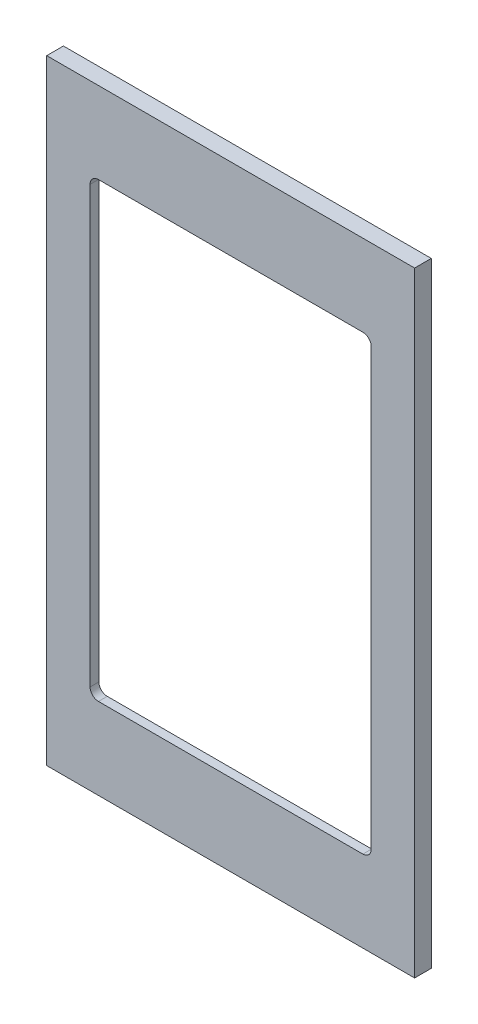
ISO-10303-21;
HEADER;
FILE_DESCRIPTION(('STEP AP214'),'2;1');
FILE_NAME('part.step','',(''),(''),'','','');
FILE_SCHEMA(('AUTOMOTIVE_DESIGN { 1 0 10303 214 1 1 1 1 }'));
ENDSEC;
DATA;
#1=APPLICATION_CONTEXT('core data for automotive mechanical design processes');
#2=APPLICATION_PROTOCOL_DEFINITION('international standard','automotive_design',2000,#1);
#3=PRODUCT_CONTEXT('',#1,'mechanical');
#4=PRODUCT('Part','Part','',(#3));
#5=PRODUCT_RELATED_PRODUCT_CATEGORY('part','',(#4));
#6=PRODUCT_DEFINITION_FORMATION('','',#4);
#7=PRODUCT_DEFINITION_CONTEXT('part definition',#1,'design');
#8=PRODUCT_DEFINITION('design','',#6,#7);
#9=PRODUCT_DEFINITION_SHAPE('','',#8);
#10=(LENGTH_UNIT() NAMED_UNIT(*) SI_UNIT(.MILLI.,.METRE.));
#11=(NAMED_UNIT(*) PLANE_ANGLE_UNIT() SI_UNIT($,.RADIAN.));
#12=(NAMED_UNIT(*) SI_UNIT($,.STERADIAN.) SOLID_ANGLE_UNIT());
#13=UNCERTAINTY_MEASURE_WITH_UNIT(LENGTH_MEASURE(1.E-05),#10,'distance_accuracy_value','');
#14=(GEOMETRIC_REPRESENTATION_CONTEXT(3) GLOBAL_UNCERTAINTY_ASSIGNED_CONTEXT((#13)) GLOBAL_UNIT_ASSIGNED_CONTEXT((#10,
#11,#12)) REPRESENTATION_CONTEXT('',''));
#15=CARTESIAN_POINT('',(0.,0.,0.));
#16=DIRECTION('',(0.,0.,1.));
#17=DIRECTION('',(1.,0.,0.));
#18=AXIS2_PLACEMENT_3D('',#15,#16,#17);
#19=CARTESIAN_POINT('',(0.,0.,3.));
#20=DIRECTION('',(0.,0.,-1.));
#21=DIRECTION('',(-1.,0.,0.));
#22=AXIS2_PLACEMENT_3D('',#19,#20,#21);
#23=PLANE('',#22);
#24=DIRECTION('',(0.,1.,0.));
#25=VECTOR('',#24,1.);
#26=CARTESIAN_POINT('',(53.5,86.,3.));
#27=LINE('',#26,#25);
#28=CARTESIAN_POINT('',(53.5,-82.825,3.));
#29=VERTEX_POINT('',#28);
#30=CARTESIAN_POINT('',(53.5,82.825,3.));
#31=VERTEX_POINT('',#30);
#32=EDGE_CURVE('E251',#29,#31,#27,.T.);
#33=ORIENTED_EDGE('',*,*,#32,.T.);
#34=CARTESIAN_POINT('',(50.325,82.825,3.));
#35=DIRECTION('',(0.,0.,-1.));
#36=DIRECTION('',(-1.,0.,0.));
#37=AXIS2_PLACEMENT_3D('',#34,#35,#36);
#38=CIRCLE('',#37,3.175);
#39=CARTESIAN_POINT('',(50.325,86.,3.));
#40=VERTEX_POINT('',#39);
#41=EDGE_CURVE('E245',#31,#40,#38,.F.);
#42=ORIENTED_EDGE('',*,*,#41,.T.);
#43=DIRECTION('',(-1.,0.,0.));
#44=VECTOR('',#43,1.);
#45=CARTESIAN_POINT('',(-53.5,86.,3.));
#46=LINE('',#45,#44);
#47=CARTESIAN_POINT('',(-50.325,86.,3.));
#48=VERTEX_POINT('',#47);
#49=EDGE_CURVE('E230',#40,#48,#46,.T.);
#50=ORIENTED_EDGE('',*,*,#49,.T.);
#51=CARTESIAN_POINT('',(-50.325,82.825,3.));
#52=DIRECTION('',(0.,0.,-1.));
#53=DIRECTION('',(-1.,0.,0.));
#54=AXIS2_PLACEMENT_3D('',#51,#52,#53);
#55=CIRCLE('',#54,3.175);
#56=CARTESIAN_POINT('',(-53.5,82.825,3.));
#57=VERTEX_POINT('',#56);
#58=EDGE_CURVE('E324',#48,#57,#55,.F.);
#59=ORIENTED_EDGE('',*,*,#58,.T.);
#60=DIRECTION('',(0.,-1.,0.));
#61=VECTOR('',#60,1.);
#62=CARTESIAN_POINT('',(-53.5,86.,3.));
#63=LINE('',#62,#61);
#64=CARTESIAN_POINT('',(-53.5,-82.825,3.));
#65=VERTEX_POINT('',#64);
#66=EDGE_CURVE('E243',#57,#65,#63,.T.);
#67=ORIENTED_EDGE('',*,*,#66,.T.);
#68=CARTESIAN_POINT('',(-50.325,-82.825,3.));
#69=DIRECTION('',(0.,0.,-1.));
#70=DIRECTION('',(-1.,0.,0.));
#71=AXIS2_PLACEMENT_3D('',#68,#69,#70);
#72=CIRCLE('',#71,3.175);
#73=CARTESIAN_POINT('',(-50.325,-86.,3.));
#74=VERTEX_POINT('',#73);
#75=EDGE_CURVE('E247',#65,#74,#72,.F.);
#76=ORIENTED_EDGE('',*,*,#75,.T.);
#77=DIRECTION('',(1.,0.,0.));
#78=VECTOR('',#77,1.);
#79=CARTESIAN_POINT('',(-53.5,-86.,3.));
#80=LINE('',#79,#78);
#81=CARTESIAN_POINT('',(50.325,-86.,3.));
#82=VERTEX_POINT('',#81);
#83=EDGE_CURVE('E249',#74,#82,#80,.T.);
#84=ORIENTED_EDGE('',*,*,#83,.T.);
#85=CARTESIAN_POINT('',(50.325,-82.825,3.));
#86=DIRECTION('',(0.,0.,-1.));
#87=DIRECTION('',(-1.,0.,0.));
#88=AXIS2_PLACEMENT_3D('',#85,#86,#87);
#89=CIRCLE('',#88,3.175);
#90=EDGE_CURVE('E253',#82,#29,#89,.F.);
#91=ORIENTED_EDGE('',*,*,#90,.T.);
#92=EDGE_LOOP('',(#33,#42,#50,#59,#67,#76,#84,#91));
#93=FACE_BOUND('',#92,.T.);
#94=DIRECTION('',(1.,0.,0.));
#95=VECTOR('',#94,1.);
#96=CARTESIAN_POINT('',(50.,22.,3.));
#97=LINE('',#96,#95);
#98=CARTESIAN_POINT('',(62.5,22.,3.));
#99=VERTEX_POINT('',#98);
#100=CARTESIAN_POINT('',(69.5,22.,3.));
#101=VERTEX_POINT('',#100);
#102=EDGE_CURVE('E54',#99,#101,#97,.T.);
#103=ORIENTED_EDGE('',*,*,#102,.T.);
#104=DIRECTION('',(0.,1.,0.));
#105=VECTOR('',#104,1.);
#106=CARTESIAN_POINT('',(69.5,22.,3.));
#107=LINE('',#106,#105);
#108=CARTESIAN_POINT('',(69.5,-18.,3.));
#109=VERTEX_POINT('',#108);
#110=EDGE_CURVE('E192',#109,#101,#107,.T.);
#111=ORIENTED_EDGE('',*,*,#110,.F.);
#112=DIRECTION('',(1.,0.,0.));
#113=VECTOR('',#112,1.);
#114=CARTESIAN_POINT('',(50.,-18.,3.));
#115=LINE('',#114,#113);
#116=CARTESIAN_POINT('',(62.5,-18.,3.));
#117=VERTEX_POINT('',#116);
#118=EDGE_CURVE('E208',#117,#109,#115,.T.);
#119=ORIENTED_EDGE('',*,*,#118,.F.);
#120=DIRECTION('',(0.,-1.,0.));
#121=VECTOR('',#120,1.);
#122=CARTESIAN_POINT('',(62.5,105.,3.));
#123=LINE('',#122,#121);
#124=CARTESIAN_POINT('',(62.5,-101.825,3.));
#125=VERTEX_POINT('',#124);
#126=EDGE_CURVE('E225',#117,#125,#123,.T.);
#127=ORIENTED_EDGE('',*,*,#126,.T.);
#128=CARTESIAN_POINT('',(59.325,-101.825,3.));
#129=DIRECTION('',(0.,0.,-1.));
#130=DIRECTION('',(-1.,0.,0.));
#131=AXIS2_PLACEMENT_3D('',#128,#129,#130);
#132=CIRCLE('',#131,3.175);
#133=CARTESIAN_POINT('',(59.325,-105.,3.));
#134=VERTEX_POINT('',#133);
#135=EDGE_CURVE('E340',#125,#134,#132,.T.);
#136=ORIENTED_EDGE('',*,*,#135,.T.);
#137=DIRECTION('',(-1.,0.,0.));
#138=VECTOR('',#137,1.);
#139=CARTESIAN_POINT('',(62.5,-105.,3.));
#140=LINE('',#139,#138);
#141=CARTESIAN_POINT('',(-59.325,-105.,3.));
#142=VERTEX_POINT('',#141);
#143=EDGE_CURVE('E227',#134,#142,#140,.T.);
#144=ORIENTED_EDGE('',*,*,#143,.T.);
#145=CARTESIAN_POINT('',(-59.325,-101.825,3.));
#146=DIRECTION('',(0.,0.,-1.));
#147=DIRECTION('',(-1.,0.,0.));
#148=AXIS2_PLACEMENT_3D('',#145,#146,#147);
#149=CIRCLE('',#148,3.175);
#150=CARTESIAN_POINT('',(-62.5,-101.825,3.));
#151=VERTEX_POINT('',#150);
#152=EDGE_CURVE('E342',#142,#151,#149,.T.);
#153=ORIENTED_EDGE('',*,*,#152,.T.);
#154=DIRECTION('',(0.,1.,0.));
#155=VECTOR('',#154,1.);
#156=CARTESIAN_POINT('',(-62.5,105.,3.));
#157=LINE('',#156,#155);
#158=CARTESIAN_POINT('',(-62.5,101.825,3.));
#159=VERTEX_POINT('',#158);
#160=EDGE_CURVE('E218',#151,#159,#157,.T.);
#161=ORIENTED_EDGE('',*,*,#160,.T.);
#162=CARTESIAN_POINT('',(-59.325,101.825,3.));
#163=DIRECTION('',(0.,0.,-1.));
#164=DIRECTION('',(-1.,0.,0.));
#165=AXIS2_PLACEMENT_3D('',#162,#163,#164);
#166=CIRCLE('',#165,3.175);
#167=CARTESIAN_POINT('',(-59.325,105.,3.));
#168=VERTEX_POINT('',#167);
#169=EDGE_CURVE('E338',#159,#168,#166,.T.);
#170=ORIENTED_EDGE('',*,*,#169,.T.);
#171=DIRECTION('',(1.,0.,0.));
#172=VECTOR('',#171,1.);
#173=CARTESIAN_POINT('',(62.5,105.,3.));
#174=LINE('',#173,#172);
#175=CARTESIAN_POINT('',(59.325,105.,3.));
#176=VERTEX_POINT('',#175);
#177=EDGE_CURVE('E221',#168,#176,#174,.T.);
#178=ORIENTED_EDGE('',*,*,#177,.T.);
#179=CARTESIAN_POINT('',(59.325,101.825,3.));
#180=DIRECTION('',(0.,0.,-1.));
#181=DIRECTION('',(-1.,0.,0.));
#182=AXIS2_PLACEMENT_3D('',#179,#180,#181);
#183=CIRCLE('',#182,3.175);
#184=CARTESIAN_POINT('',(62.5,101.825,3.));
#185=VERTEX_POINT('',#184);
#186=EDGE_CURVE('E336',#176,#185,#183,.T.);
#187=ORIENTED_EDGE('',*,*,#186,.T.);
#188=EDGE_CURVE('E207',#185,#99,#123,.T.);
#189=ORIENTED_EDGE('',*,*,#188,.T.);
#190=EDGE_LOOP('',(#103,#111,#119,#127,#136,#144,#153,#161,#170,#178,#187,#189));
#191=FACE_BOUND('',#190,.T.);
#192=ADVANCED_FACE('F32',(#93,#191),#23,.T.);
#193=CARTESIAN_POINT('',(50.,-18.,3.));
#194=DIRECTION('',(0.,-1.,0.));
#195=DIRECTION('',(1.,0.,0.));
#196=AXIS2_PLACEMENT_3D('',#193,#194,#195);
#197=PLANE('',#196);
#198=DIRECTION('',(0.,0.,1.));
#199=VECTOR('',#198,1.);
#200=CARTESIAN_POINT('',(69.5,-18.,-40.0031248779392));
#201=LINE('',#200,#199);
#202=CARTESIAN_POINT('',(69.5,-18.,0.));
#203=VERTEX_POINT('',#202);
#204=EDGE_CURVE('E195',#203,#109,#201,.T.);
#205=ORIENTED_EDGE('',*,*,#204,.F.);
#206=DIRECTION('',(1.,0.,0.));
#207=VECTOR('',#206,1.);
#208=CARTESIAN_POINT('',(0.,-18.,0.));
#209=LINE('',#208,#207);
#210=CARTESIAN_POINT('',(62.5,-18.,0.));
#211=VERTEX_POINT('',#210);
#212=EDGE_CURVE('E214',#211,#203,#209,.T.);
#213=ORIENTED_EDGE('',*,*,#212,.F.);
#214=DIRECTION('',(0.,0.,-1.));
#215=VECTOR('',#214,1.);
#216=CARTESIAN_POINT('',(62.5,-18.,3.));
#217=LINE('',#216,#215);
#218=EDGE_CURVE('E11',#117,#211,#217,.T.);
#219=ORIENTED_EDGE('',*,*,#218,.F.);
#220=ORIENTED_EDGE('',*,*,#118,.T.);
#221=EDGE_LOOP('',(#205,#213,#219,#220));
#222=FACE_BOUND('',#221,.T.);
#223=ADVANCED_FACE('F372',(#222),#197,.F.);
#224=CARTESIAN_POINT('',(50.,22.,3.));
#225=DIRECTION('',(0.,1.,0.));
#226=DIRECTION('',(-1.,0.,0.));
#227=AXIS2_PLACEMENT_3D('',#224,#225,#226);
#228=PLANE('',#227);
#229=DIRECTION('',(0.,0.,1.));
#230=VECTOR('',#229,1.);
#231=CARTESIAN_POINT('',(69.5,22.,-40.0031248779392));
#232=LINE('',#231,#230);
#233=CARTESIAN_POINT('',(69.5,22.,0.));
#234=VERTEX_POINT('',#233);
#235=EDGE_CURVE('E47',#234,#101,#232,.T.);
#236=ORIENTED_EDGE('',*,*,#235,.T.);
#237=ORIENTED_EDGE('',*,*,#102,.F.);
#238=DIRECTION('',(0.,0.,1.));
#239=VECTOR('',#238,1.);
#240=CARTESIAN_POINT('',(62.5,22.,3.));
#241=LINE('',#240,#239);
#242=CARTESIAN_POINT('',(62.5,22.,0.));
#243=VERTEX_POINT('',#242);
#244=EDGE_CURVE('E40',#243,#99,#241,.T.);
#245=ORIENTED_EDGE('',*,*,#244,.F.);
#246=DIRECTION('',(-1.,0.,0.));
#247=VECTOR('',#246,1.);
#248=CARTESIAN_POINT('',(0.,22.,0.));
#249=LINE('',#248,#247);
#250=EDGE_CURVE('E202',#234,#243,#249,.T.);
#251=ORIENTED_EDGE('',*,*,#250,.F.);
#252=EDGE_LOOP('',(#236,#237,#245,#251));
#253=FACE_BOUND('',#252,.T.);
#254=ADVANCED_FACE('F201',(#253),#228,.F.);
#255=CARTESIAN_POINT('',(62.5,105.,3.));
#256=DIRECTION('',(1.,0.,0.));
#257=DIRECTION('',(0.,1.,0.));
#258=AXIS2_PLACEMENT_3D('',#255,#256,#257);
#259=PLANE('',#258);
#260=ORIENTED_EDGE('',*,*,#126,.F.);
#261=ORIENTED_EDGE('',*,*,#218,.T.);
#262=DIRECTION('',(0.,-1.,0.));
#263=VECTOR('',#262,1.);
#264=CARTESIAN_POINT('',(62.5,105.,0.));
#265=LINE('',#264,#263);
#266=CARTESIAN_POINT('',(62.5,-101.825,0.));
#267=VERTEX_POINT('',#266);
#268=EDGE_CURVE('E236',#211,#267,#265,.T.);
#269=ORIENTED_EDGE('',*,*,#268,.T.);
#270=DIRECTION('',(0.,0.,-1.));
#271=VECTOR('',#270,1.);
#272=CARTESIAN_POINT('',(62.5,-101.825,3.));
#273=LINE('',#272,#271);
#274=EDGE_CURVE('E347',#267,#125,#273,.F.);
#275=ORIENTED_EDGE('',*,*,#274,.T.);
#276=EDGE_LOOP('',(#260,#261,#269,#275));
#277=FACE_BOUND('',#276,.T.);
#278=ADVANCED_FACE('F376',(#277),#259,.F.);
#279=CARTESIAN_POINT('',(53.5,86.,0.));
#280=DIRECTION('',(1.,0.,0.));
#281=DIRECTION('',(0.,1.,0.));
#282=AXIS2_PLACEMENT_3D('',#279,#280,#281);
#283=PLANE('',#282);
#284=ORIENTED_EDGE('',*,*,#32,.F.);
#285=DIRECTION('',(0.,0.,1.));
#286=VECTOR('',#285,1.);
#287=CARTESIAN_POINT('',(53.5,-82.825,6.35));
#288=LINE('',#287,#286);
#289=CARTESIAN_POINT('',(53.5,-82.825,6.35));
#290=VERTEX_POINT('',#289);
#291=EDGE_CURVE('E309',#29,#290,#288,.T.);
#292=ORIENTED_EDGE('',*,*,#291,.T.);
#293=DIRECTION('',(0.,1.,0.));
#294=VECTOR('',#293,1.);
#295=CARTESIAN_POINT('',(53.5,86.,6.35));
#296=LINE('',#295,#294);
#297=CARTESIAN_POINT('',(53.5,82.825,6.35));
#298=VERTEX_POINT('',#297);
#299=EDGE_CURVE('E255',#290,#298,#296,.T.);
#300=ORIENTED_EDGE('',*,*,#299,.T.);
#301=DIRECTION('',(0.,0.,1.));
#302=VECTOR('',#301,1.);
#303=CARTESIAN_POINT('',(53.5,82.825,0.));
#304=LINE('',#303,#302);
#305=EDGE_CURVE('E306',#298,#31,#304,.F.);
#306=ORIENTED_EDGE('',*,*,#305,.T.);
#307=EDGE_LOOP('',(#284,#292,#300,#306));
#308=FACE_BOUND('',#307,.T.);
#309=ADVANCED_FACE('F433',(#308),#283,.F.);
#310=CARTESIAN_POINT('',(-53.5,-86.,0.));
#311=DIRECTION('',(0.,-1.,0.));
#312=DIRECTION('',(0.,0.,-1.));
#313=AXIS2_PLACEMENT_3D('',#310,#311,#312);
#314=PLANE('',#313);
#315=ORIENTED_EDGE('',*,*,#83,.F.);
#316=DIRECTION('',(0.,0.,1.));
#317=VECTOR('',#316,1.);
#318=CARTESIAN_POINT('',(-50.325,-86.,6.35));
#319=LINE('',#318,#317);
#320=CARTESIAN_POINT('',(-50.325,-86.,6.35));
#321=VERTEX_POINT('',#320);
#322=EDGE_CURVE('E299',#74,#321,#319,.T.);
#323=ORIENTED_EDGE('',*,*,#322,.T.);
#324=DIRECTION('',(1.,0.,0.));
#325=VECTOR('',#324,1.);
#326=CARTESIAN_POINT('',(-53.5,-86.,6.35));
#327=LINE('',#326,#325);
#328=CARTESIAN_POINT('',(50.325,-86.,6.35));
#329=VERTEX_POINT('',#328);
#330=EDGE_CURVE('E264',#321,#329,#327,.T.);
#331=ORIENTED_EDGE('',*,*,#330,.T.);
#332=DIRECTION('',(0.,0.,1.));
#333=VECTOR('',#332,1.);
#334=CARTESIAN_POINT('',(50.325,-86.,0.));
#335=LINE('',#334,#333);
#336=EDGE_CURVE('E296',#329,#82,#335,.F.);
#337=ORIENTED_EDGE('',*,*,#336,.T.);
#338=EDGE_LOOP('',(#315,#323,#331,#337));
#339=FACE_BOUND('',#338,.T.);
#340=ADVANCED_FACE('F429',(#339),#314,.F.);
#341=CARTESIAN_POINT('',(-53.5,86.,0.));
#342=DIRECTION('',(-1.,0.,0.));
#343=DIRECTION('',(0.,-1.,0.));
#344=AXIS2_PLACEMENT_3D('',#341,#342,#343);
#345=PLANE('',#344);
#346=ORIENTED_EDGE('',*,*,#66,.F.);
#347=DIRECTION('',(0.,0.,1.));
#348=VECTOR('',#347,1.);
#349=CARTESIAN_POINT('',(-53.5,82.825,6.35));
#350=LINE('',#349,#348);
#351=CARTESIAN_POINT('',(-53.5,82.825,6.35));
#352=VERTEX_POINT('',#351);
#353=EDGE_CURVE('E301',#57,#352,#350,.T.);
#354=ORIENTED_EDGE('',*,*,#353,.T.);
#355=DIRECTION('',(0.,-1.,0.));
#356=VECTOR('',#355,1.);
#357=CARTESIAN_POINT('',(-53.5,86.,6.35));
#358=LINE('',#357,#356);
#359=CARTESIAN_POINT('',(-53.5,-82.825,6.35));
#360=VERTEX_POINT('',#359);
#361=EDGE_CURVE('E261',#352,#360,#358,.T.);
#362=ORIENTED_EDGE('',*,*,#361,.T.);
#363=DIRECTION('',(0.,0.,1.));
#364=VECTOR('',#363,1.);
#365=CARTESIAN_POINT('',(-53.5,-82.825,0.));
#366=LINE('',#365,#364);
#367=EDGE_CURVE('E303',#360,#65,#366,.F.);
#368=ORIENTED_EDGE('',*,*,#367,.T.);
#369=EDGE_LOOP('',(#346,#354,#362,#368));
#370=FACE_BOUND('',#369,.T.);
#371=ADVANCED_FACE('F432',(#370),#345,.F.);
#372=CARTESIAN_POINT('',(-53.5,86.,0.));
#373=DIRECTION('',(0.,1.,0.));
#374=DIRECTION('',(0.,0.,1.));
#375=AXIS2_PLACEMENT_3D('',#372,#373,#374);
#376=PLANE('',#375);
#377=ORIENTED_EDGE('',*,*,#49,.F.);
#378=DIRECTION('',(0.,0.,1.));
#379=VECTOR('',#378,1.);
#380=CARTESIAN_POINT('',(50.325,86.,6.35));
#381=LINE('',#380,#379);
#382=CARTESIAN_POINT('',(50.325,86.,6.35));
#383=VERTEX_POINT('',#382);
#384=EDGE_CURVE('E314',#40,#383,#381,.T.);
#385=ORIENTED_EDGE('',*,*,#384,.T.);
#386=DIRECTION('',(-1.,0.,0.));
#387=VECTOR('',#386,1.);
#388=CARTESIAN_POINT('',(-53.5,86.,6.35));
#389=LINE('',#388,#387);
#390=CARTESIAN_POINT('',(-50.325,86.,6.35));
#391=VERTEX_POINT('',#390);
#392=EDGE_CURVE('E258',#383,#391,#389,.T.);
#393=ORIENTED_EDGE('',*,*,#392,.T.);
#394=DIRECTION('',(0.,0.,1.));
#395=VECTOR('',#394,1.);
#396=CARTESIAN_POINT('',(-50.325,86.,0.));
#397=LINE('',#396,#395);
#398=EDGE_CURVE('E311',#391,#48,#397,.F.);
#399=ORIENTED_EDGE('',*,*,#398,.T.);
#400=EDGE_LOOP('',(#377,#385,#393,#399));
#401=FACE_BOUND('',#400,.T.);
#402=ADVANCED_FACE('F437',(#401),#376,.F.);
#403=CARTESIAN_POINT('',(-50.325,-82.825,0.));
#404=DIRECTION('',(0.,0.,-1.));
#405=DIRECTION('',(-1.,0.,0.));
#406=AXIS2_PLACEMENT_3D('',#403,#404,#405);
#407=CYLINDRICAL_SURFACE('',#406,3.175);
#408=ORIENTED_EDGE('',*,*,#75,.F.);
#409=ORIENTED_EDGE('',*,*,#367,.F.);
#410=CARTESIAN_POINT('',(-50.325,-82.825,6.35));
#411=DIRECTION('',(0.,0.,1.));
#412=DIRECTION('',(1.,0.,0.));
#413=AXIS2_PLACEMENT_3D('',#410,#411,#412);
#414=CIRCLE('',#413,3.175);
#415=EDGE_CURVE('E316',#321,#360,#414,.F.);
#416=ORIENTED_EDGE('',*,*,#415,.F.);
#417=ORIENTED_EDGE('',*,*,#322,.F.);
#418=EDGE_LOOP('',(#408,#409,#416,#417));
#419=FACE_BOUND('',#418,.T.);
#420=ADVANCED_FACE('F441',(#419),#407,.F.);
#421=CARTESIAN_POINT('',(50.325,-82.825,0.));
#422=DIRECTION('',(0.,0.,-1.));
#423=DIRECTION('',(-1.,0.,0.));
#424=AXIS2_PLACEMENT_3D('',#421,#422,#423);
#425=CYLINDRICAL_SURFACE('',#424,3.175);
#426=ORIENTED_EDGE('',*,*,#90,.F.);
#427=ORIENTED_EDGE('',*,*,#336,.F.);
#428=CARTESIAN_POINT('',(50.325,-82.825,6.35));
#429=DIRECTION('',(0.,0.,1.));
#430=DIRECTION('',(1.,0.,0.));
#431=AXIS2_PLACEMENT_3D('',#428,#429,#430);
#432=CIRCLE('',#431,3.175);
#433=EDGE_CURVE('E318',#290,#329,#432,.F.);
#434=ORIENTED_EDGE('',*,*,#433,.F.);
#435=ORIENTED_EDGE('',*,*,#291,.F.);
#436=EDGE_LOOP('',(#426,#427,#434,#435));
#437=FACE_BOUND('',#436,.T.);
#438=ADVANCED_FACE('F472',(#437),#425,.F.);
#439=CARTESIAN_POINT('',(50.325,82.825,0.));
#440=DIRECTION('',(0.,0.,-1.));
#441=DIRECTION('',(-1.,0.,0.));
#442=AXIS2_PLACEMENT_3D('',#439,#440,#441);
#443=CYLINDRICAL_SURFACE('',#442,3.175);
#444=ORIENTED_EDGE('',*,*,#41,.F.);
#445=ORIENTED_EDGE('',*,*,#305,.F.);
#446=CARTESIAN_POINT('',(50.325,82.825,6.35));
#447=DIRECTION('',(0.,0.,1.));
#448=DIRECTION('',(1.,0.,0.));
#449=AXIS2_PLACEMENT_3D('',#446,#447,#448);
#450=CIRCLE('',#449,3.175);
#451=EDGE_CURVE('E320',#383,#298,#450,.F.);
#452=ORIENTED_EDGE('',*,*,#451,.F.);
#453=ORIENTED_EDGE('',*,*,#384,.F.);
#454=EDGE_LOOP('',(#444,#445,#452,#453));
#455=FACE_BOUND('',#454,.T.);
#456=ADVANCED_FACE('F476',(#455),#443,.F.);
#457=CARTESIAN_POINT('',(-50.325,82.825,0.));
#458=DIRECTION('',(0.,0.,-1.));
#459=DIRECTION('',(-1.,0.,0.));
#460=AXIS2_PLACEMENT_3D('',#457,#458,#459);
#461=CYLINDRICAL_SURFACE('',#460,3.175);
#462=ORIENTED_EDGE('',*,*,#58,.F.);
#463=ORIENTED_EDGE('',*,*,#398,.F.);
#464=CARTESIAN_POINT('',(-50.325,82.825,6.35));
#465=DIRECTION('',(0.,0.,1.));
#466=DIRECTION('',(1.,0.,0.));
#467=AXIS2_PLACEMENT_3D('',#464,#465,#466);
#468=CIRCLE('',#467,3.175);
#469=EDGE_CURVE('E322',#352,#391,#468,.F.);
#470=ORIENTED_EDGE('',*,*,#469,.F.);
#471=ORIENTED_EDGE('',*,*,#353,.F.);
#472=EDGE_LOOP('',(#462,#463,#470,#471));
#473=FACE_BOUND('',#472,.T.);
#474=ADVANCED_FACE('F468',(#473),#461,.F.);
#475=CARTESIAN_POINT('',(70.,117.,6.35));
#476=DIRECTION('',(-1.,0.,0.));
#477=DIRECTION('',(0.,-1.,0.));
#478=AXIS2_PLACEMENT_3D('',#475,#476,#477);
#479=PLANE('',#478);
#480=DIRECTION('',(0.,1.,0.));
#481=VECTOR('',#480,1.);
#482=CARTESIAN_POINT('',(70.,117.,0.));
#483=LINE('',#482,#481);
#484=CARTESIAN_POINT('',(70.,-117.,0.));
#485=VERTEX_POINT('',#484);
#486=CARTESIAN_POINT('',(70.,117.,0.));
#487=VERTEX_POINT('',#486);
#488=EDGE_CURVE('E267',#485,#487,#483,.T.);
#489=ORIENTED_EDGE('',*,*,#488,.T.);
#490=DIRECTION('',(0.,0.,-1.));
#491=VECTOR('',#490,1.);
#492=CARTESIAN_POINT('',(70.,117.,6.35));
#493=LINE('',#492,#491);
#494=CARTESIAN_POINT('',(70.,117.,6.35));
#495=VERTEX_POINT('',#494);
#496=EDGE_CURVE('E293',#495,#487,#493,.T.);
#497=ORIENTED_EDGE('',*,*,#496,.F.);
#498=DIRECTION('',(0.,1.,0.));
#499=VECTOR('',#498,1.);
#500=CARTESIAN_POINT('',(70.,117.,6.35));
#501=LINE('',#500,#499);
#502=CARTESIAN_POINT('',(70.,-117.,6.35));
#503=VERTEX_POINT('',#502);
#504=EDGE_CURVE('E268',#503,#495,#501,.T.);
#505=ORIENTED_EDGE('',*,*,#504,.F.);
#506=DIRECTION('',(0.,0.,-1.));
#507=VECTOR('',#506,1.);
#508=CARTESIAN_POINT('',(70.,-117.,6.35));
#509=LINE('',#508,#507);
#510=EDGE_CURVE('E278',#503,#485,#509,.T.);
#511=ORIENTED_EDGE('',*,*,#510,.T.);
#512=EDGE_LOOP('',(#489,#497,#505,#511));
#513=FACE_BOUND('',#512,.T.);
#514=ADVANCED_FACE('F464',(#513),#479,.F.);
#515=CARTESIAN_POINT('',(-70.,117.,6.35));
#516=DIRECTION('',(0.,-1.,0.));
#517=DIRECTION('',(0.,0.,-1.));
#518=AXIS2_PLACEMENT_3D('',#515,#516,#517);
#519=PLANE('',#518);
#520=DIRECTION('',(-1.,0.,0.));
#521=VECTOR('',#520,1.);
#522=CARTESIAN_POINT('',(-70.,117.,0.));
#523=LINE('',#522,#521);
#524=CARTESIAN_POINT('',(-70.,117.,0.));
#525=VERTEX_POINT('',#524);
#526=EDGE_CURVE('E280',#487,#525,#523,.T.);
#527=ORIENTED_EDGE('',*,*,#526,.T.);
#528=DIRECTION('',(0.,0.,-1.));
#529=VECTOR('',#528,1.);
#530=CARTESIAN_POINT('',(-70.,117.,6.35));
#531=LINE('',#530,#529);
#532=CARTESIAN_POINT('',(-70.,117.,6.35));
#533=VERTEX_POINT('',#532);
#534=EDGE_CURVE('E290',#533,#525,#531,.T.);
#535=ORIENTED_EDGE('',*,*,#534,.F.);
#536=DIRECTION('',(-1.,0.,0.));
#537=VECTOR('',#536,1.);
#538=CARTESIAN_POINT('',(-70.,117.,6.35));
#539=LINE('',#538,#537);
#540=EDGE_CURVE('E271',#495,#533,#539,.T.);
#541=ORIENTED_EDGE('',*,*,#540,.F.);
#542=ORIENTED_EDGE('',*,*,#496,.T.);
#543=EDGE_LOOP('',(#527,#535,#541,#542));
#544=FACE_BOUND('',#543,.T.);
#545=ADVANCED_FACE('F460',(#544),#519,.F.);
#546=CARTESIAN_POINT('',(-70.,117.,6.35));
#547=DIRECTION('',(1.,0.,0.));
#548=DIRECTION('',(0.,1.,0.));
#549=AXIS2_PLACEMENT_3D('',#546,#547,#548);
#550=PLANE('',#549);
#551=DIRECTION('',(0.,-1.,0.));
#552=VECTOR('',#551,1.);
#553=CARTESIAN_POINT('',(-70.,117.,0.));
#554=LINE('',#553,#552);
#555=CARTESIAN_POINT('',(-70.,-117.,0.));
#556=VERTEX_POINT('',#555);
#557=EDGE_CURVE('E282',#525,#556,#554,.T.);
#558=ORIENTED_EDGE('',*,*,#557,.T.);
#559=DIRECTION('',(0.,0.,-1.));
#560=VECTOR('',#559,1.);
#561=CARTESIAN_POINT('',(-70.,-117.,6.35));
#562=LINE('',#561,#560);
#563=CARTESIAN_POINT('',(-70.,-117.,6.35));
#564=VERTEX_POINT('',#563);
#565=EDGE_CURVE('E287',#564,#556,#562,.T.);
#566=ORIENTED_EDGE('',*,*,#565,.F.);
#567=DIRECTION('',(0.,-1.,0.));
#568=VECTOR('',#567,1.);
#569=CARTESIAN_POINT('',(-70.,117.,6.35));
#570=LINE('',#569,#568);
#571=EDGE_CURVE('E274',#533,#564,#570,.T.);
#572=ORIENTED_EDGE('',*,*,#571,.F.);
#573=ORIENTED_EDGE('',*,*,#534,.T.);
#574=EDGE_LOOP('',(#558,#566,#572,#573));
#575=FACE_BOUND('',#574,.T.);
#576=ADVANCED_FACE('F456',(#575),#550,.F.);
#577=CARTESIAN_POINT('',(-70.,-117.,6.35));
#578=DIRECTION('',(0.,1.,0.));
#579=DIRECTION('',(0.,0.,1.));
#580=AXIS2_PLACEMENT_3D('',#577,#578,#579);
#581=PLANE('',#580);
#582=DIRECTION('',(1.,0.,0.));
#583=VECTOR('',#582,1.);
#584=CARTESIAN_POINT('',(-70.,-117.,0.));
#585=LINE('',#584,#583);
#586=EDGE_CURVE('E272',#556,#485,#585,.T.);
#587=ORIENTED_EDGE('',*,*,#586,.T.);
#588=ORIENTED_EDGE('',*,*,#510,.F.);
#589=DIRECTION('',(1.,0.,0.));
#590=VECTOR('',#589,1.);
#591=CARTESIAN_POINT('',(-70.,-117.,6.35));
#592=LINE('',#591,#590);
#593=EDGE_CURVE('E276',#564,#503,#592,.T.);
#594=ORIENTED_EDGE('',*,*,#593,.F.);
#595=ORIENTED_EDGE('',*,*,#565,.T.);
#596=EDGE_LOOP('',(#587,#588,#594,#595));
#597=FACE_BOUND('',#596,.T.);
#598=ADVANCED_FACE('F449',(#597),#581,.F.);
#599=CARTESIAN_POINT('',(0.,0.,6.35));
#600=DIRECTION('',(0.,0.,1.));
#601=DIRECTION('',(1.,0.,0.));
#602=AXIS2_PLACEMENT_3D('',#599,#600,#601);
#603=PLANE('',#602);
#604=ORIENTED_EDGE('',*,*,#299,.F.);
#605=ORIENTED_EDGE('',*,*,#433,.T.);
#606=ORIENTED_EDGE('',*,*,#330,.F.);
#607=ORIENTED_EDGE('',*,*,#415,.T.);
#608=ORIENTED_EDGE('',*,*,#361,.F.);
#609=ORIENTED_EDGE('',*,*,#469,.T.);
#610=ORIENTED_EDGE('',*,*,#392,.F.);
#611=ORIENTED_EDGE('',*,*,#451,.T.);
#612=EDGE_LOOP('',(#604,#605,#606,#607,#608,#609,#610,#611));
#613=FACE_BOUND('',#612,.T.);
#614=ORIENTED_EDGE('',*,*,#504,.T.);
#615=ORIENTED_EDGE('',*,*,#540,.T.);
#616=ORIENTED_EDGE('',*,*,#571,.T.);
#617=ORIENTED_EDGE('',*,*,#593,.T.);
#618=EDGE_LOOP('',(#614,#615,#616,#617));
#619=FACE_BOUND('',#618,.T.);
#620=ADVANCED_FACE('F446',(#613,#619),#603,.T.);
#621=CARTESIAN_POINT('',(0.,0.,0.));
#622=DIRECTION('',(0.,0.,1.));
#623=DIRECTION('',(1.,0.,0.));
#624=AXIS2_PLACEMENT_3D('',#621,#622,#623);
#625=PLANE('',#624);
#626=ORIENTED_EDGE('',*,*,#526,.F.);
#627=ORIENTED_EDGE('',*,*,#488,.F.);
#628=ORIENTED_EDGE('',*,*,#586,.F.);
#629=ORIENTED_EDGE('',*,*,#557,.F.);
#630=EDGE_LOOP('',(#626,#627,#628,#629));
#631=FACE_BOUND('',#630,.T.);
#632=ORIENTED_EDGE('',*,*,#268,.F.);
#633=ORIENTED_EDGE('',*,*,#212,.T.);
#634=DIRECTION('',(0.,-1.,0.));
#635=VECTOR('',#634,1.);
#636=CARTESIAN_POINT('',(69.5,22.,0.));
#637=LINE('',#636,#635);
#638=EDGE_CURVE('E203',#234,#203,#637,.T.);
#639=ORIENTED_EDGE('',*,*,#638,.F.);
#640=ORIENTED_EDGE('',*,*,#250,.T.);
#641=CARTESIAN_POINT('',(62.5,101.825,0.));
#642=VERTEX_POINT('',#641);
#643=EDGE_CURVE('E237',#642,#243,#265,.T.);
#644=ORIENTED_EDGE('',*,*,#643,.F.);
#645=CARTESIAN_POINT('',(59.325,101.825,0.));
#646=DIRECTION('',(0.,0.,1.));
#647=DIRECTION('',(1.,0.,0.));
#648=AXIS2_PLACEMENT_3D('',#645,#646,#647);
#649=CIRCLE('',#648,3.175);
#650=CARTESIAN_POINT('',(59.325,105.,0.));
#651=VERTEX_POINT('',#650);
#652=EDGE_CURVE('E362',#642,#651,#649,.T.);
#653=ORIENTED_EDGE('',*,*,#652,.T.);
#654=DIRECTION('',(1.,0.,0.));
#655=VECTOR('',#654,1.);
#656=CARTESIAN_POINT('',(62.5,105.,0.));
#657=LINE('',#656,#655);
#658=CARTESIAN_POINT('',(-59.325,105.,0.));
#659=VERTEX_POINT('',#658);
#660=EDGE_CURVE('E233',#659,#651,#657,.T.);
#661=ORIENTED_EDGE('',*,*,#660,.F.);
#662=CARTESIAN_POINT('',(-59.325,101.825,0.));
#663=DIRECTION('',(0.,0.,1.));
#664=DIRECTION('',(1.,0.,0.));
#665=AXIS2_PLACEMENT_3D('',#662,#663,#664);
#666=CIRCLE('',#665,3.175);
#667=CARTESIAN_POINT('',(-62.5,101.825,0.));
#668=VERTEX_POINT('',#667);
#669=EDGE_CURVE('E360',#659,#668,#666,.T.);
#670=ORIENTED_EDGE('',*,*,#669,.T.);
#671=DIRECTION('',(0.,1.,0.));
#672=VECTOR('',#671,1.);
#673=CARTESIAN_POINT('',(-62.5,105.,0.));
#674=LINE('',#673,#672);
#675=CARTESIAN_POINT('',(-62.5,-101.825,0.));
#676=VERTEX_POINT('',#675);
#677=EDGE_CURVE('E217',#676,#668,#674,.T.);
#678=ORIENTED_EDGE('',*,*,#677,.F.);
#679=CARTESIAN_POINT('',(-59.325,-101.825,0.));
#680=DIRECTION('',(0.,0.,1.));
#681=DIRECTION('',(1.,0.,0.));
#682=AXIS2_PLACEMENT_3D('',#679,#680,#681);
#683=CIRCLE('',#682,3.175);
#684=CARTESIAN_POINT('',(-59.325,-105.,0.));
#685=VERTEX_POINT('',#684);
#686=EDGE_CURVE('E355',#676,#685,#683,.T.);
#687=ORIENTED_EDGE('',*,*,#686,.T.);
#688=DIRECTION('',(-1.,0.,0.));
#689=VECTOR('',#688,1.);
#690=CARTESIAN_POINT('',(62.5,-105.,0.));
#691=LINE('',#690,#689);
#692=CARTESIAN_POINT('',(59.325,-105.,0.));
#693=VERTEX_POINT('',#692);
#694=EDGE_CURVE('E222',#693,#685,#691,.T.);
#695=ORIENTED_EDGE('',*,*,#694,.F.);
#696=CARTESIAN_POINT('',(59.325,-101.825,0.));
#697=DIRECTION('',(0.,0.,1.));
#698=DIRECTION('',(1.,0.,0.));
#699=AXIS2_PLACEMENT_3D('',#696,#697,#698);
#700=CIRCLE('',#699,3.175);
#701=EDGE_CURVE('E357',#693,#267,#700,.T.);
#702=ORIENTED_EDGE('',*,*,#701,.T.);
#703=EDGE_LOOP('',(#632,#633,#639,#640,#644,#653,#661,#670,#678,#687,#695,#702));
#704=FACE_BOUND('',#703,.T.);
#705=ADVANCED_FACE('F369',(#631,#704),#625,.F.);
#706=CARTESIAN_POINT('',(-62.5,105.,3.));
#707=DIRECTION('',(-1.,0.,0.));
#708=DIRECTION('',(0.,-1.,0.));
#709=AXIS2_PLACEMENT_3D('',#706,#707,#708);
#710=PLANE('',#709);
#711=ORIENTED_EDGE('',*,*,#160,.F.);
#712=DIRECTION('',(0.,0.,-1.));
#713=VECTOR('',#712,1.);
#714=CARTESIAN_POINT('',(-62.5,-101.825,0.));
#715=LINE('',#714,#713);
#716=EDGE_CURVE('E328',#151,#676,#715,.T.);
#717=ORIENTED_EDGE('',*,*,#716,.T.);
#718=ORIENTED_EDGE('',*,*,#677,.T.);
#719=DIRECTION('',(0.,0.,-1.));
#720=VECTOR('',#719,1.);
#721=CARTESIAN_POINT('',(-62.5,101.825,3.));
#722=LINE('',#721,#720);
#723=EDGE_CURVE('E326',#668,#159,#722,.F.);
#724=ORIENTED_EDGE('',*,*,#723,.T.);
#725=EDGE_LOOP('',(#711,#717,#718,#724));
#726=FACE_BOUND('',#725,.T.);
#727=ADVANCED_FACE('F394',(#726),#710,.F.);
#728=CARTESIAN_POINT('',(62.5,-105.,3.));
#729=DIRECTION('',(0.,-1.,0.));
#730=DIRECTION('',(0.,0.,-1.));
#731=AXIS2_PLACEMENT_3D('',#728,#729,#730);
#732=PLANE('',#731);
#733=ORIENTED_EDGE('',*,*,#694,.T.);
#734=DIRECTION('',(0.,0.,-1.));
#735=VECTOR('',#734,1.);
#736=CARTESIAN_POINT('',(-59.325,-105.,3.));
#737=LINE('',#736,#735);
#738=EDGE_CURVE('E334',#685,#142,#737,.F.);
#739=ORIENTED_EDGE('',*,*,#738,.T.);
#740=ORIENTED_EDGE('',*,*,#143,.F.);
#741=DIRECTION('',(0.,0.,-1.));
#742=VECTOR('',#741,1.);
#743=CARTESIAN_POINT('',(59.325,-105.,0.));
#744=LINE('',#743,#742);
#745=EDGE_CURVE('E331',#134,#693,#744,.T.);
#746=ORIENTED_EDGE('',*,*,#745,.T.);
#747=EDGE_LOOP('',(#733,#739,#740,#746));
#748=FACE_BOUND('',#747,.T.);
#749=ADVANCED_FACE('F385',(#748),#732,.F.);
#750=ORIENTED_EDGE('',*,*,#643,.T.);
#751=ORIENTED_EDGE('',*,*,#244,.T.);
#752=ORIENTED_EDGE('',*,*,#188,.F.);
#753=DIRECTION('',(0.,0.,-1.));
#754=VECTOR('',#753,1.);
#755=CARTESIAN_POINT('',(62.5,101.825,0.));
#756=LINE('',#755,#754);
#757=EDGE_CURVE('E344',#185,#642,#756,.T.);
#758=ORIENTED_EDGE('',*,*,#757,.T.);
#759=EDGE_LOOP('',(#750,#751,#752,#758));
#760=FACE_BOUND('',#759,.T.);
#761=ADVANCED_FACE('F364',(#760),#259,.F.);
#762=CARTESIAN_POINT('',(62.5,105.,3.));
#763=DIRECTION('',(0.,1.,0.));
#764=DIRECTION('',(0.,0.,1.));
#765=AXIS2_PLACEMENT_3D('',#762,#763,#764);
#766=PLANE('',#765);
#767=ORIENTED_EDGE('',*,*,#177,.F.);
#768=DIRECTION('',(0.,0.,-1.));
#769=VECTOR('',#768,1.);
#770=CARTESIAN_POINT('',(-59.325,105.,0.));
#771=LINE('',#770,#769);
#772=EDGE_CURVE('E352',#168,#659,#771,.T.);
#773=ORIENTED_EDGE('',*,*,#772,.T.);
#774=ORIENTED_EDGE('',*,*,#660,.T.);
#775=DIRECTION('',(0.,0.,-1.));
#776=VECTOR('',#775,1.);
#777=CARTESIAN_POINT('',(59.325,105.,3.));
#778=LINE('',#777,#776);
#779=EDGE_CURVE('E350',#651,#176,#778,.F.);
#780=ORIENTED_EDGE('',*,*,#779,.T.);
#781=EDGE_LOOP('',(#767,#773,#774,#780));
#782=FACE_BOUND('',#781,.T.);
#783=ADVANCED_FACE('F403',(#782),#766,.F.);
#784=CARTESIAN_POINT('',(-59.325,-101.825,3.));
#785=DIRECTION('',(0.,0.,1.));
#786=DIRECTION('',(1.,0.,0.));
#787=AXIS2_PLACEMENT_3D('',#784,#785,#786);
#788=CYLINDRICAL_SURFACE('',#787,3.175);
#789=ORIENTED_EDGE('',*,*,#152,.F.);
#790=ORIENTED_EDGE('',*,*,#738,.F.);
#791=ORIENTED_EDGE('',*,*,#686,.F.);
#792=ORIENTED_EDGE('',*,*,#716,.F.);
#793=EDGE_LOOP('',(#789,#790,#791,#792));
#794=FACE_BOUND('',#793,.T.);
#795=ADVANCED_FACE('F389',(#794),#788,.F.);
#796=CARTESIAN_POINT('',(59.325,-101.825,3.));
#797=DIRECTION('',(0.,0.,1.));
#798=DIRECTION('',(1.,0.,0.));
#799=AXIS2_PLACEMENT_3D('',#796,#797,#798);
#800=CYLINDRICAL_SURFACE('',#799,3.175);
#801=ORIENTED_EDGE('',*,*,#135,.F.);
#802=ORIENTED_EDGE('',*,*,#274,.F.);
#803=ORIENTED_EDGE('',*,*,#701,.F.);
#804=ORIENTED_EDGE('',*,*,#745,.F.);
#805=EDGE_LOOP('',(#801,#802,#803,#804));
#806=FACE_BOUND('',#805,.T.);
#807=ADVANCED_FACE('F381',(#806),#800,.F.);
#808=CARTESIAN_POINT('',(-59.325,101.825,3.));
#809=DIRECTION('',(0.,0.,1.));
#810=DIRECTION('',(1.,0.,0.));
#811=AXIS2_PLACEMENT_3D('',#808,#809,#810);
#812=CYLINDRICAL_SURFACE('',#811,3.175);
#813=ORIENTED_EDGE('',*,*,#169,.F.);
#814=ORIENTED_EDGE('',*,*,#723,.F.);
#815=ORIENTED_EDGE('',*,*,#669,.F.);
#816=ORIENTED_EDGE('',*,*,#772,.F.);
#817=EDGE_LOOP('',(#813,#814,#815,#816));
#818=FACE_BOUND('',#817,.T.);
#819=ADVANCED_FACE('F398',(#818),#812,.F.);
#820=CARTESIAN_POINT('',(59.325,101.825,3.));
#821=DIRECTION('',(0.,0.,1.));
#822=DIRECTION('',(1.,0.,0.));
#823=AXIS2_PLACEMENT_3D('',#820,#821,#822);
#824=CYLINDRICAL_SURFACE('',#823,3.175);
#825=ORIENTED_EDGE('',*,*,#186,.F.);
#826=ORIENTED_EDGE('',*,*,#779,.F.);
#827=ORIENTED_EDGE('',*,*,#652,.F.);
#828=ORIENTED_EDGE('',*,*,#757,.F.);
#829=EDGE_LOOP('',(#825,#826,#827,#828));
#830=FACE_BOUND('',#829,.T.);
#831=ADVANCED_FACE('F34',(#830),#824,.F.);
#832=CARTESIAN_POINT('',(69.5,22.,-40.0031248779392));
#833=DIRECTION('',(1.,0.,0.));
#834=DIRECTION('',(0.,0.,-1.));
#835=AXIS2_PLACEMENT_3D('',#832,#833,#834);
#836=PLANE('',#835);
#837=ORIENTED_EDGE('',*,*,#235,.F.);
#838=ORIENTED_EDGE('',*,*,#638,.T.);
#839=ORIENTED_EDGE('',*,*,#204,.T.);
#840=ORIENTED_EDGE('',*,*,#110,.T.);
#841=EDGE_LOOP('',(#837,#838,#839,#840));
#842=FACE_BOUND('',#841,.T.);
#843=ADVANCED_FACE('F193',(#842),#836,.F.);
#844=CLOSED_SHELL('',(#192,#223,#254,#278,#309,#340,#371,#402,#420,#438,#456,#474,#514,#545,
#576,#598,#620,#705,#727,#749,#761,#783,#795,#807,#819,#831,#843));
#845=MANIFOLD_SOLID_BREP('B2',#844);
#846=ADVANCED_BREP_SHAPE_REPRESENTATION('',(#18,#845),#14);
#847=SHAPE_DEFINITION_REPRESENTATION(#9,#846);
ENDSEC;
END-ISO-10303-21;
